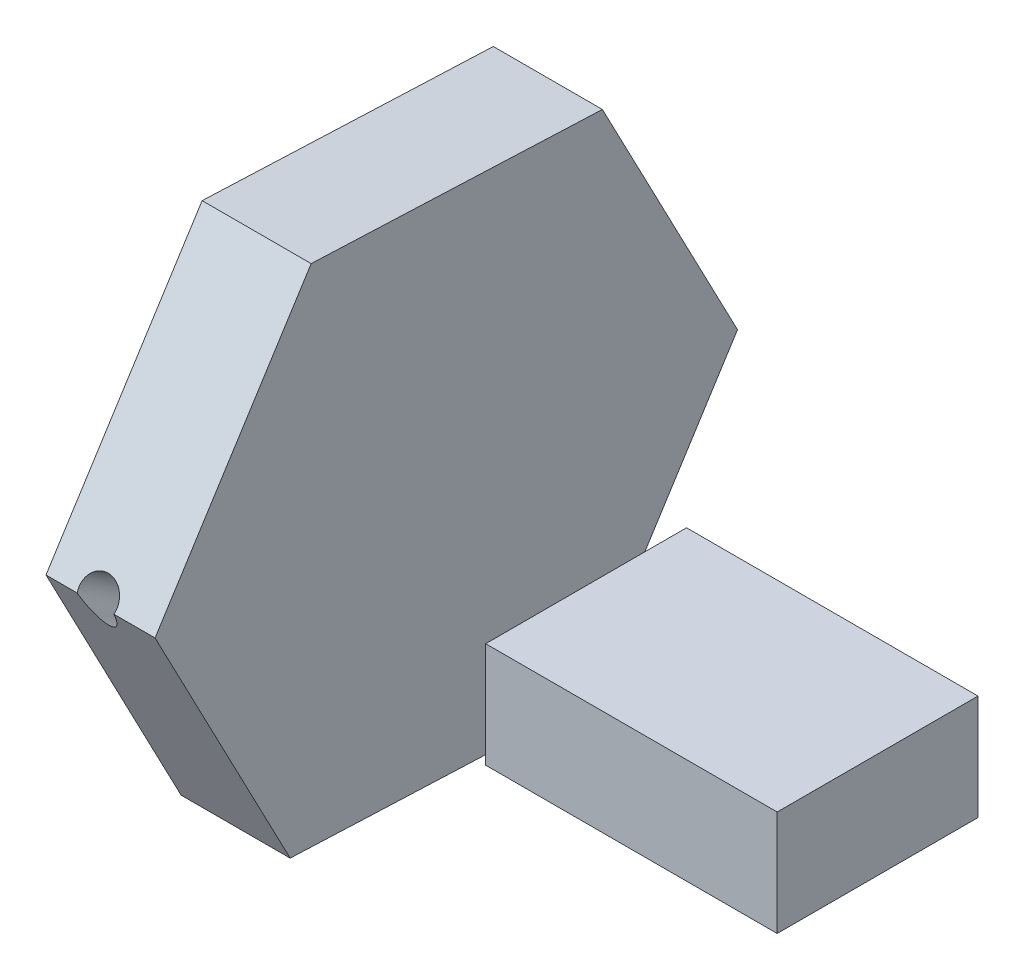
ISO-10303-21;
HEADER;
FILE_DESCRIPTION(('STEP AP214'),'2;1');
FILE_NAME('part.step','',(''),(''),'','','');
FILE_SCHEMA(('AUTOMOTIVE_DESIGN { 1 0 10303 214 1 1 1 1 }'));
ENDSEC;
DATA;
#1=APPLICATION_CONTEXT('core data for automotive mechanical design processes');
#2=APPLICATION_PROTOCOL_DEFINITION('international standard','automotive_design',2000,#1);
#3=PRODUCT_CONTEXT('',#1,'mechanical');
#4=PRODUCT('Part','Part','',(#3));
#5=PRODUCT_RELATED_PRODUCT_CATEGORY('part','',(#4));
#6=PRODUCT_DEFINITION_FORMATION('','',#4);
#7=PRODUCT_DEFINITION_CONTEXT('part definition',#1,'design');
#8=PRODUCT_DEFINITION('design','',#6,#7);
#9=PRODUCT_DEFINITION_SHAPE('','',#8);
#10=(LENGTH_UNIT() NAMED_UNIT(*) SI_UNIT(.MILLI.,.METRE.));
#11=(NAMED_UNIT(*) PLANE_ANGLE_UNIT() SI_UNIT($,.RADIAN.));
#12=(NAMED_UNIT(*) SI_UNIT($,.STERADIAN.) SOLID_ANGLE_UNIT());
#13=UNCERTAINTY_MEASURE_WITH_UNIT(LENGTH_MEASURE(1.E-05),#10,'distance_accuracy_value','');
#14=(GEOMETRIC_REPRESENTATION_CONTEXT(3) GLOBAL_UNCERTAINTY_ASSIGNED_CONTEXT((#13)) GLOBAL_UNIT_ASSIGNED_CONTEXT((#10,
#11,#12)) REPRESENTATION_CONTEXT('',''));
#15=CARTESIAN_POINT('',(0.,0.,0.));
#16=DIRECTION('',(0.,0.,1.));
#17=DIRECTION('',(1.,0.,0.));
#18=AXIS2_PLACEMENT_3D('',#15,#16,#17);
#19=CARTESIAN_POINT('',(-114.046,223.633194113683,-151.552831197321));
#20=DIRECTION('',(0.,0.463594869972143,-0.886047287979322));
#21=DIRECTION('',(0.,0.886047287979322,0.463594869972143));
#22=AXIS2_PLACEMENT_3D('',#19,#20,#21);
#23=PLANE('',#22);
#24=DIRECTION('',(0.,0.886047287979322,0.463594869972143));
#25=VECTOR('',#24,1.);
#26=CARTESIAN_POINT('',(0.,223.633194113683,-151.552831197321));
#27=LINE('',#26,#25);
#28=CARTESIAN_POINT('',(0.,223.633194113683,-151.552831197321));
#29=VERTEX_POINT('',#28);
#30=CARTESIAN_POINT('',(0.,493.70040748978,-10.2491148298119));
#31=VERTEX_POINT('',#30);
#32=EDGE_CURVE('E148',#29,#31,#27,.T.);
#33=ORIENTED_EDGE('',*,*,#32,.F.);
#34=DIRECTION('',(1.,0.,0.));
#35=VECTOR('',#34,1.);
#36=CARTESIAN_POINT('',(-114.046,223.633194113683,-151.552831197321));
#37=LINE('',#36,#35);
#38=CARTESIAN_POINT('',(-114.046,223.633194113683,-151.552831197321));
#39=VERTEX_POINT('',#38);
#40=EDGE_CURVE('E12',#39,#29,#37,.T.);
#41=ORIENTED_EDGE('',*,*,#40,.F.);
#42=DIRECTION('',(0.,0.886047287979322,0.463594869972143));
#43=VECTOR('',#42,1.);
#44=CARTESIAN_POINT('',(-114.046,223.633194113683,-151.552831197321));
#45=LINE('',#44,#43);
#46=CARTESIAN_POINT('',(-114.046,493.70040748978,-10.2491148298119));
#47=VERTEX_POINT('',#46);
#48=EDGE_CURVE('E165',#39,#47,#45,.T.);
#49=ORIENTED_EDGE('',*,*,#48,.T.);
#50=DIRECTION('',(1.,0.,0.));
#51=VECTOR('',#50,1.);
#52=CARTESIAN_POINT('',(-114.046,493.70040748978,-10.2491148298119));
#53=LINE('',#52,#51);
#54=EDGE_CURVE('E46',#47,#31,#53,.T.);
#55=ORIENTED_EDGE('',*,*,#54,.T.);
#56=EDGE_LOOP('',(#33,#41,#49,#55));
#57=FACE_BOUND('',#56,.T.);
#58=ADVANCED_FACE('F43',(#57),#23,.T.);
#59=CARTESIAN_POINT('',(-114.046,-33.7730205977799,11.6803781318971));
#60=DIRECTION('',(0.,-0.535542025358328,-0.844508578449681));
#61=DIRECTION('',(0.,0.844508578449681,-0.535542025358328));
#62=AXIS2_PLACEMENT_3D('',#59,#60,#61);
#63=PLANE('',#62);
#64=CARTESIAN_POINT('',(-62.2641208737491,-29.5934538278569,9.02992115584839));
#65=DIRECTION('',(0.,-0.535542025358328,-0.844508578449681));
#66=DIRECTION('',(0.,0.844508578449681,-0.535542025358328));
#67=AXIS2_PLACEMENT_3D('',#64,#65,#66);
#68=CIRCLE('',#67,19.8471462844361);
#69=CARTESIAN_POINT('',(-81.4843059683229,-33.7730205977799,11.6803781318971));
#70=VERTEX_POINT('',#69);
#71=CARTESIAN_POINT('',(-43.0439357791754,-33.7730205977799,11.6803781318971));
#72=VERTEX_POINT('',#71);
#73=EDGE_CURVE('E58',#70,#72,#68,.T.);
#74=ORIENTED_EDGE('',*,*,#73,.F.);
#75=DIRECTION('',(1.,0.,0.));
#76=VECTOR('',#75,1.);
#77=CARTESIAN_POINT('',(-114.046,-33.7730205977799,11.6803781318971));
#78=LINE('',#77,#76);
#79=CARTESIAN_POINT('',(-114.046,-33.7730205977799,11.6803781318971));
#80=VERTEX_POINT('',#79);
#81=EDGE_CURVE('E51',#80,#70,#78,.T.);
#82=ORIENTED_EDGE('',*,*,#81,.F.);
#83=DIRECTION('',(0.,0.844508578449681,-0.535542025358328));
#84=VECTOR('',#83,1.);
#85=CARTESIAN_POINT('',(-114.046,-33.7730205977799,11.6803781318971));
#86=LINE('',#85,#84);
#87=EDGE_CURVE('E134',#80,#39,#86,.T.);
#88=ORIENTED_EDGE('',*,*,#87,.T.);
#89=ORIENTED_EDGE('',*,*,#40,.T.);
#90=DIRECTION('',(0.,0.844508578449681,-0.535542025358328));
#91=VECTOR('',#90,1.);
#92=CARTESIAN_POINT('',(0.,-33.7730205977799,11.6803781318971));
#93=LINE('',#92,#91);
#94=CARTESIAN_POINT('',(0.,-33.7730205977799,11.6803781318971));
#95=VERTEX_POINT('',#94);
#96=EDGE_CURVE('E163',#95,#29,#93,.T.);
#97=ORIENTED_EDGE('',*,*,#96,.F.);
#98=EDGE_CURVE('E126',#72,#95,#78,.T.);
#99=ORIENTED_EDGE('',*,*,#98,.F.);
#100=EDGE_LOOP('',(#74,#82,#88,#89,#97,#99));
#101=FACE_BOUND('',#100,.T.);
#102=ADVANCED_FACE('F174',(#101),#63,.T.);
#103=CARTESIAN_POINT('',(-114.046,-21.1120219331452,316.217303828625));
#104=DIRECTION('',(0.,-0.999136895330471,0.0415387095296415));
#105=DIRECTION('',(0.,-0.0415387095296415,-0.999136895330471));
#106=AXIS2_PLACEMENT_3D('',#103,#104,#105);
#107=PLANE('',#106);
#108=CARTESIAN_POINT('',(-62.2641208737491,-34.1841799736486,1.79069915671516));
#109=DIRECTION('',(0.,-0.999136895330471,0.0415387095296415));
#110=DIRECTION('',(0.,0.0415387095296415,0.999136895330471));
#111=AXIS2_PLACEMENT_3D('',#108,#109,#110);
#112=ELLIPSE('',#111,39.6942925688722,19.8471462844361);
#113=EDGE_CURVE('E118',#72,#70,#112,.T.);
#114=ORIENTED_EDGE('',*,*,#113,.F.);
#115=ORIENTED_EDGE('',*,*,#98,.T.);
#116=DIRECTION('',(0.,-0.0415387095296416,-0.999136895330471));
#117=VECTOR('',#116,1.);
#118=CARTESIAN_POINT('',(0.,-21.1120219331452,316.217303828625));
#119=LINE('',#118,#117);
#120=CARTESIAN_POINT('',(0.,-21.1120219331452,316.217303828625));
#121=VERTEX_POINT('',#120);
#122=EDGE_CURVE('E160',#121,#95,#119,.T.);
#123=ORIENTED_EDGE('',*,*,#122,.F.);
#124=DIRECTION('',(1.,0.,0.));
#125=VECTOR('',#124,1.);
#126=CARTESIAN_POINT('',(-114.046,-21.1120219331452,316.217303828625));
#127=LINE('',#126,#125);
#128=CARTESIAN_POINT('',(-114.046,-21.1120219331452,316.217303828625));
#129=VERTEX_POINT('',#128);
#130=EDGE_CURVE('E124',#129,#121,#127,.T.);
#131=ORIENTED_EDGE('',*,*,#130,.F.);
#132=DIRECTION('',(0.,-0.0415387095296416,-0.999136895330471));
#133=VECTOR('',#132,1.);
#134=CARTESIAN_POINT('',(-114.046,-21.1120219331452,316.217303828625));
#135=LINE('',#134,#133);
#136=EDGE_CURVE('E139',#129,#80,#135,.T.);
#137=ORIENTED_EDGE('',*,*,#136,.T.);
#138=ORIENTED_EDGE('',*,*,#81,.T.);
#139=EDGE_LOOP('',(#114,#115,#123,#131,#137,#138));
#140=FACE_BOUND('',#139,.T.);
#141=ADVANCED_FACE('F170',(#140),#107,.T.);
#142=CARTESIAN_POINT('',(-114.046,248.955191442952,457.521020196134));
#143=DIRECTION('',(0.,-0.463594869972143,0.886047287979322));
#144=DIRECTION('',(0.,-0.886047287979322,-0.463594869972143));
#145=AXIS2_PLACEMENT_3D('',#142,#143,#144);
#146=PLANE('',#145);
#147=CARTESIAN_POINT('',(-62.2641208737491,257.725484358667,462.109785219218));
#148=DIRECTION('',(0.,-0.463594869972143,0.886047287979322));
#149=DIRECTION('',(0.,0.886047287979322,0.463594869972143));
#150=AXIS2_PLACEMENT_3D('',#147,#148,#149);
#151=ELLIPSE('',#150,39.6942925688722,19.8471462844361);
#152=CARTESIAN_POINT('',(-81.4843059683229,248.955191442952,457.521020196134));
#153=VERTEX_POINT('',#152);
#154=CARTESIAN_POINT('',(-43.0439357791753,248.955191442952,457.521020196134));
#155=VERTEX_POINT('',#154);
#156=EDGE_CURVE('E65',#153,#155,#151,.T.);
#157=ORIENTED_EDGE('',*,*,#156,.F.);
#158=DIRECTION('',(1.,0.,0.));
#159=VECTOR('',#158,1.);
#160=CARTESIAN_POINT('',(-114.046,248.955191442952,457.521020196134));
#161=LINE('',#160,#159);
#162=CARTESIAN_POINT('',(-114.046,248.955191442952,457.521020196134));
#163=VERTEX_POINT('',#162);
#164=EDGE_CURVE('E114',#163,#153,#161,.T.);
#165=ORIENTED_EDGE('',*,*,#164,.F.);
#166=DIRECTION('',(0.,-0.886047287979322,-0.463594869972143));
#167=VECTOR('',#166,1.);
#168=CARTESIAN_POINT('',(-114.046,248.955191442952,457.521020196134));
#169=LINE('',#168,#167);
#170=EDGE_CURVE('E144',#163,#129,#169,.T.);
#171=ORIENTED_EDGE('',*,*,#170,.T.);
#172=ORIENTED_EDGE('',*,*,#130,.T.);
#173=DIRECTION('',(0.,-0.886047287979322,-0.463594869972143));
#174=VECTOR('',#173,1.);
#175=CARTESIAN_POINT('',(0.,248.955191442952,457.521020196134));
#176=LINE('',#175,#174);
#177=CARTESIAN_POINT('',(0.,248.955191442952,457.521020196134));
#178=VERTEX_POINT('',#177);
#179=EDGE_CURVE('E157',#178,#121,#176,.T.);
#180=ORIENTED_EDGE('',*,*,#179,.F.);
#181=EDGE_CURVE('E117',#155,#178,#161,.T.);
#182=ORIENTED_EDGE('',*,*,#181,.F.);
#183=EDGE_LOOP('',(#157,#165,#171,#172,#180,#182));
#184=FACE_BOUND('',#183,.T.);
#185=ADVANCED_FACE('F112',(#184),#146,.T.);
#186=CARTESIAN_POINT('',(-114.046,506.361406154415,294.287810866916));
#187=DIRECTION('',(0.,0.535542025358327,0.844508578449681));
#188=DIRECTION('',(0.,-0.844508578449681,0.535542025358327));
#189=AXIS2_PLACEMENT_3D('',#186,#187,#188);
#190=PLANE('',#189);
#191=CARTESIAN_POINT('',(-62.2641208737491,253.134758212875,454.870563220085));
#192=DIRECTION('',(0.,0.535542025358328,0.844508578449681));
#193=DIRECTION('',(0.,-0.844508578449681,0.535542025358328));
#194=AXIS2_PLACEMENT_3D('',#191,#192,#193);
#195=CIRCLE('',#194,19.8471462844361);
#196=EDGE_CURVE('E105',#155,#153,#195,.T.);
#197=ORIENTED_EDGE('',*,*,#196,.F.);
#198=ORIENTED_EDGE('',*,*,#181,.T.);
#199=DIRECTION('',(0.,-0.844508578449681,0.535542025358327));
#200=VECTOR('',#199,1.);
#201=CARTESIAN_POINT('',(0.,506.361406154415,294.287810866916));
#202=LINE('',#201,#200);
#203=CARTESIAN_POINT('',(0.,506.361406154415,294.287810866916));
#204=VERTEX_POINT('',#203);
#205=EDGE_CURVE('E154',#204,#178,#202,.T.);
#206=ORIENTED_EDGE('',*,*,#205,.F.);
#207=DIRECTION('',(1.,0.,0.));
#208=VECTOR('',#207,1.);
#209=CARTESIAN_POINT('',(-114.046,506.361406154415,294.287810866916));
#210=LINE('',#209,#208);
#211=CARTESIAN_POINT('',(-114.046,506.361406154415,294.287810866916));
#212=VERTEX_POINT('',#211);
#213=EDGE_CURVE('E128',#212,#204,#210,.T.);
#214=ORIENTED_EDGE('',*,*,#213,.F.);
#215=DIRECTION('',(0.,-0.844508578449681,0.535542025358327));
#216=VECTOR('',#215,1.);
#217=CARTESIAN_POINT('',(-114.046,506.361406154415,294.287810866916));
#218=LINE('',#217,#216);
#219=EDGE_CURVE('E123',#212,#163,#218,.T.);
#220=ORIENTED_EDGE('',*,*,#219,.T.);
#221=ORIENTED_EDGE('',*,*,#164,.T.);
#222=EDGE_LOOP('',(#197,#198,#206,#214,#220,#221));
#223=FACE_BOUND('',#222,.T.);
#224=ADVANCED_FACE('F121',(#223),#190,.T.);
#225=CARTESIAN_POINT('',(-114.046,493.70040748978,-10.2491148298119));
#226=DIRECTION('',(0.,0.999136895330471,-0.0415387095296416));
#227=DIRECTION('',(0.,0.0415387095296416,0.999136895330471));
#228=AXIS2_PLACEMENT_3D('',#225,#226,#227);
#229=PLANE('',#228);
#230=DIRECTION('',(0.,0.0415387095296416,0.999136895330471));
#231=VECTOR('',#230,1.);
#232=CARTESIAN_POINT('',(0.,493.70040748978,-10.2491148298119));
#233=LINE('',#232,#231);
#234=EDGE_CURVE('E151',#31,#204,#233,.T.);
#235=ORIENTED_EDGE('',*,*,#234,.F.);
#236=ORIENTED_EDGE('',*,*,#54,.F.);
#237=DIRECTION('',(0.,0.0415387095296416,0.999136895330471));
#238=VECTOR('',#237,1.);
#239=CARTESIAN_POINT('',(-114.046,493.70040748978,-10.2491148298119));
#240=LINE('',#239,#238);
#241=EDGE_CURVE('E178',#47,#212,#240,.T.);
#242=ORIENTED_EDGE('',*,*,#241,.T.);
#243=ORIENTED_EDGE('',*,*,#213,.T.);
#244=EDGE_LOOP('',(#235,#236,#242,#243));
#245=FACE_BOUND('',#244,.T.);
#246=ADVANCED_FACE('F176',(#245),#229,.T.);
#247=CARTESIAN_POINT('',(-114.046,0.,0.));
#248=DIRECTION('',(1.,0.,0.));
#249=DIRECTION('',(0.,0.,-1.));
#250=AXIS2_PLACEMENT_3D('',#247,#248,#249);
#251=PLANE('',#250);
#252=ORIENTED_EDGE('',*,*,#48,.F.);
#253=ORIENTED_EDGE('',*,*,#87,.F.);
#254=ORIENTED_EDGE('',*,*,#136,.F.);
#255=ORIENTED_EDGE('',*,*,#170,.F.);
#256=ORIENTED_EDGE('',*,*,#219,.F.);
#257=ORIENTED_EDGE('',*,*,#241,.F.);
#258=EDGE_LOOP('',(#252,#253,#254,#255,#256,#257));
#259=FACE_BOUND('',#258,.T.);
#260=ADVANCED_FACE('F180',(#259),#251,.F.);
#261=CARTESIAN_POINT('',(0.,0.,0.));
#262=DIRECTION('',(1.,0.,0.));
#263=DIRECTION('',(0.,0.,-1.));
#264=AXIS2_PLACEMENT_3D('',#261,#262,#263);
#265=PLANE('',#264);
#266=ORIENTED_EDGE('',*,*,#32,.T.);
#267=ORIENTED_EDGE('',*,*,#234,.T.);
#268=ORIENTED_EDGE('',*,*,#205,.T.);
#269=ORIENTED_EDGE('',*,*,#179,.T.);
#270=ORIENTED_EDGE('',*,*,#122,.T.);
#271=ORIENTED_EDGE('',*,*,#96,.T.);
#272=EDGE_LOOP('',(#266,#267,#268,#269,#270,#271));
#273=FACE_BOUND('',#272,.T.);
#274=ADVANCED_FACE('F173',(#273),#265,.T.);
#275=CARTESIAN_POINT('',(-62.2641208737491,-104.969949100281,-109.833013696822));
#276=DIRECTION('',(0.,0.535542025358328,0.844508578449681));
#277=DIRECTION('',(0.,-0.844508578449681,0.535542025358328));
#278=AXIS2_PLACEMENT_3D('',#275,#276,#277);
#279=CYLINDRICAL_SURFACE('',#278,19.8471462844361);
#280=ORIENTED_EDGE('',*,*,#73,.T.);
#281=ORIENTED_EDGE('',*,*,#113,.T.);
#282=EDGE_LOOP('',(#280,#281));
#283=FACE_BOUND('',#282,.T.);
#284=ORIENTED_EDGE('',*,*,#156,.T.);
#285=ORIENTED_EDGE('',*,*,#196,.T.);
#286=EDGE_LOOP('',(#284,#285));
#287=FACE_BOUND('',#286,.T.);
#288=ADVANCED_FACE('F106',(#283,#287),#279,.F.);
#289=CLOSED_SHELL('',(#58,#102,#141,#185,#224,#246,#260,#274,#288));
#290=MANIFOLD_SOLID_BREP('B2',#289);
#291=CARTESIAN_POINT('',(304.8,-39.1810061187243,111.761661165417));
#292=DIRECTION('',(0.,0.,-1.));
#293=DIRECTION('',(-1.,0.,0.));
#294=AXIS2_PLACEMENT_3D('',#291,#292,#293);
#295=PLANE('',#294);
#296=DIRECTION('',(0.,-1.,0.));
#297=VECTOR('',#296,1.);
#298=CARTESIAN_POINT('',(0.,-39.1810061187243,111.761661165417));
#299=LINE('',#298,#297);
#300=CARTESIAN_POINT('',(0.,70.8756540507511,111.761661165417));
#301=VERTEX_POINT('',#300);
#302=CARTESIAN_POINT('',(0.,-39.1810061187243,111.761661165417));
#303=VERTEX_POINT('',#302);
#304=EDGE_CURVE('E323',#301,#303,#299,.T.);
#305=ORIENTED_EDGE('',*,*,#304,.T.);
#306=DIRECTION('',(-1.,0.,0.));
#307=VECTOR('',#306,1.);
#308=CARTESIAN_POINT('',(304.8,-39.1810061187243,111.761661165417));
#309=LINE('',#308,#307);
#310=CARTESIAN_POINT('',(304.8,-39.1810061187243,111.761661165417));
#311=VERTEX_POINT('',#310);
#312=EDGE_CURVE('E41',#311,#303,#309,.T.);
#313=ORIENTED_EDGE('',*,*,#312,.F.);
#314=DIRECTION('',(0.,-1.,0.));
#315=VECTOR('',#314,1.);
#316=CARTESIAN_POINT('',(304.8,-39.1810061187243,111.761661165417));
#317=LINE('',#316,#315);
#318=CARTESIAN_POINT('',(304.8,70.8756540507511,111.761661165417));
#319=VERTEX_POINT('',#318);
#320=EDGE_CURVE('E311',#319,#311,#317,.T.);
#321=ORIENTED_EDGE('',*,*,#320,.F.);
#322=DIRECTION('',(-1.,0.,0.));
#323=VECTOR('',#322,1.);
#324=CARTESIAN_POINT('',(304.8,70.8756540507511,111.761661165417));
#325=LINE('',#324,#323);
#326=EDGE_CURVE('E319',#319,#301,#325,.T.);
#327=ORIENTED_EDGE('',*,*,#326,.T.);
#328=EDGE_LOOP('',(#305,#313,#321,#327));
#329=FACE_BOUND('',#328,.T.);
#330=ADVANCED_FACE('F260',(#329),#295,.F.);
#331=CARTESIAN_POINT('',(304.8,-39.1810061187243,111.761661165417));
#332=DIRECTION('',(0.,1.,0.));
#333=DIRECTION('',(0.,0.,1.));
#334=AXIS2_PLACEMENT_3D('',#331,#332,#333);
#335=PLANE('',#334);
#336=DIRECTION('',(0.,0.,-1.));
#337=VECTOR('',#336,1.);
#338=CARTESIAN_POINT('',(0.,-39.1810061187243,111.761661165417));
#339=LINE('',#338,#337);
#340=CARTESIAN_POINT('',(0.,-39.1810061187243,-98.2407714448634));
#341=VERTEX_POINT('',#340);
#342=EDGE_CURVE('E315',#303,#341,#339,.T.);
#343=ORIENTED_EDGE('',*,*,#342,.T.);
#344=DIRECTION('',(-1.,0.,0.));
#345=VECTOR('',#344,1.);
#346=CARTESIAN_POINT('',(304.8,-39.1810061187243,-98.2407714448634));
#347=LINE('',#346,#345);
#348=CARTESIAN_POINT('',(304.8,-39.1810061187243,-98.2407714448634));
#349=VERTEX_POINT('',#348);
#350=EDGE_CURVE('E268',#349,#341,#347,.T.);
#351=ORIENTED_EDGE('',*,*,#350,.F.);
#352=DIRECTION('',(0.,0.,-1.));
#353=VECTOR('',#352,1.);
#354=CARTESIAN_POINT('',(304.8,-39.1810061187243,111.761661165417));
#355=LINE('',#354,#353);
#356=EDGE_CURVE('E306',#311,#349,#355,.T.);
#357=ORIENTED_EDGE('',*,*,#356,.F.);
#358=ORIENTED_EDGE('',*,*,#312,.T.);
#359=EDGE_LOOP('',(#343,#351,#357,#358));
#360=FACE_BOUND('',#359,.T.);
#361=ADVANCED_FACE('F314',(#360),#335,.F.);
#362=CARTESIAN_POINT('',(304.8,-39.1810061187243,-98.2407714448634));
#363=DIRECTION('',(0.,0.,1.));
#364=DIRECTION('',(1.,0.,0.));
#365=AXIS2_PLACEMENT_3D('',#362,#363,#364);
#366=PLANE('',#365);
#367=DIRECTION('',(0.,1.,0.));
#368=VECTOR('',#367,1.);
#369=CARTESIAN_POINT('',(0.,-39.1810061187243,-98.2407714448634));
#370=LINE('',#369,#368);
#371=CARTESIAN_POINT('',(0.,70.8756540507511,-98.2407714448634));
#372=VERTEX_POINT('',#371);
#373=EDGE_CURVE('E293',#341,#372,#370,.T.);
#374=ORIENTED_EDGE('',*,*,#373,.T.);
#375=DIRECTION('',(-1.,0.,0.));
#376=VECTOR('',#375,1.);
#377=CARTESIAN_POINT('',(304.8,70.8756540507511,-98.2407714448634));
#378=LINE('',#377,#376);
#379=CARTESIAN_POINT('',(304.8,70.8756540507511,-98.2407714448634));
#380=VERTEX_POINT('',#379);
#381=EDGE_CURVE('E316',#380,#372,#378,.T.);
#382=ORIENTED_EDGE('',*,*,#381,.F.);
#383=DIRECTION('',(0.,1.,0.));
#384=VECTOR('',#383,1.);
#385=CARTESIAN_POINT('',(304.8,-39.1810061187243,-98.2407714448634));
#386=LINE('',#385,#384);
#387=EDGE_CURVE('E309',#349,#380,#386,.T.);
#388=ORIENTED_EDGE('',*,*,#387,.F.);
#389=ORIENTED_EDGE('',*,*,#350,.T.);
#390=EDGE_LOOP('',(#374,#382,#388,#389));
#391=FACE_BOUND('',#390,.T.);
#392=ADVANCED_FACE('F317',(#391),#366,.F.);
#393=CARTESIAN_POINT('',(304.8,70.8756540507511,111.761661165417));
#394=DIRECTION('',(0.,-1.,0.));
#395=DIRECTION('',(0.,0.,-1.));
#396=AXIS2_PLACEMENT_3D('',#393,#394,#395);
#397=PLANE('',#396);
#398=DIRECTION('',(0.,0.,1.));
#399=VECTOR('',#398,1.);
#400=CARTESIAN_POINT('',(0.,70.8756540507511,111.761661165417));
#401=LINE('',#400,#399);
#402=EDGE_CURVE('E299',#372,#301,#401,.T.);
#403=ORIENTED_EDGE('',*,*,#402,.T.);
#404=ORIENTED_EDGE('',*,*,#326,.F.);
#405=DIRECTION('',(0.,0.,1.));
#406=VECTOR('',#405,1.);
#407=CARTESIAN_POINT('',(304.8,70.8756540507511,111.761661165417));
#408=LINE('',#407,#406);
#409=EDGE_CURVE('E276',#380,#319,#408,.T.);
#410=ORIENTED_EDGE('',*,*,#409,.F.);
#411=ORIENTED_EDGE('',*,*,#381,.T.);
#412=EDGE_LOOP('',(#403,#404,#410,#411));
#413=FACE_BOUND('',#412,.T.);
#414=ADVANCED_FACE('F330',(#413),#397,.F.);
#415=CARTESIAN_POINT('',(304.8,0.,0.));
#416=DIRECTION('',(-1.,0.,0.));
#417=DIRECTION('',(0.,0.,1.));
#418=AXIS2_PLACEMENT_3D('',#415,#416,#417);
#419=PLANE('',#418);
#420=ORIENTED_EDGE('',*,*,#320,.T.);
#421=ORIENTED_EDGE('',*,*,#356,.T.);
#422=ORIENTED_EDGE('',*,*,#387,.T.);
#423=ORIENTED_EDGE('',*,*,#409,.T.);
#424=EDGE_LOOP('',(#420,#421,#422,#423));
#425=FACE_BOUND('',#424,.T.);
#426=ADVANCED_FACE('F307',(#425),#419,.F.);
#427=CARTESIAN_POINT('',(0.,0.,0.));
#428=DIRECTION('',(-1.,0.,0.));
#429=DIRECTION('',(0.,0.,1.));
#430=AXIS2_PLACEMENT_3D('',#427,#428,#429);
#431=PLANE('',#430);
#432=ORIENTED_EDGE('',*,*,#304,.F.);
#433=ORIENTED_EDGE('',*,*,#402,.F.);
#434=ORIENTED_EDGE('',*,*,#373,.F.);
#435=ORIENTED_EDGE('',*,*,#342,.F.);
#436=EDGE_LOOP('',(#432,#433,#434,#435));
#437=FACE_BOUND('',#436,.T.);
#438=ADVANCED_FACE('F333',(#437),#431,.T.);
#439=CLOSED_SHELL('',(#330,#361,#392,#414,#426,#438));
#440=MANIFOLD_SOLID_BREP('B6',#439);
#441=ADVANCED_BREP_SHAPE_REPRESENTATION('',(#18,#290,#440),#14);
#442=SHAPE_DEFINITION_REPRESENTATION(#9,#441);
ENDSEC;
END-ISO-10303-21;
